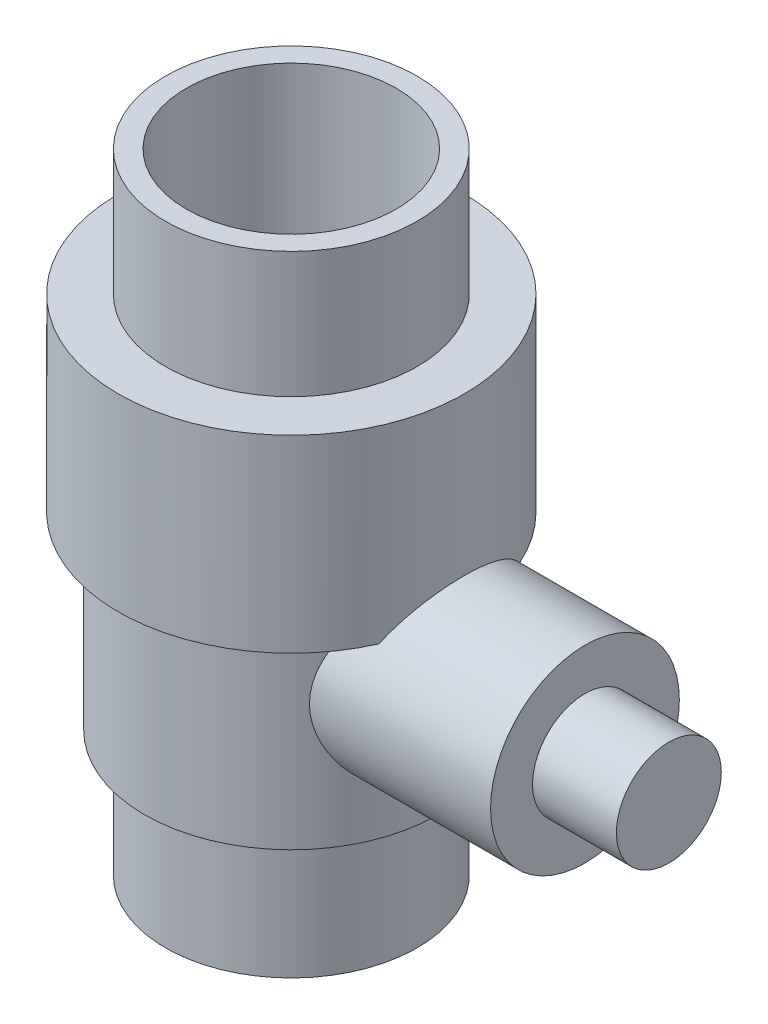
ISO-10303-21;
HEADER;
FILE_DESCRIPTION(('STEP AP214'),'2;1');
FILE_NAME('part.step','',(''),(''),'','','');
FILE_SCHEMA(('AUTOMOTIVE_DESIGN { 1 0 10303 214 1 1 1 1 }'));
ENDSEC;
DATA;
#1=APPLICATION_CONTEXT('core data for automotive mechanical design processes');
#2=APPLICATION_PROTOCOL_DEFINITION('international standard','automotive_design',2000,#1);
#3=PRODUCT_CONTEXT('',#1,'mechanical');
#4=PRODUCT('Part','Part','',(#3));
#5=PRODUCT_RELATED_PRODUCT_CATEGORY('part','',(#4));
#6=PRODUCT_DEFINITION_FORMATION('','',#4);
#7=PRODUCT_DEFINITION_CONTEXT('part definition',#1,'design');
#8=PRODUCT_DEFINITION('design','',#6,#7);
#9=PRODUCT_DEFINITION_SHAPE('','',#8);
#10=(LENGTH_UNIT() NAMED_UNIT(*) SI_UNIT(.MILLI.,.METRE.));
#11=(NAMED_UNIT(*) PLANE_ANGLE_UNIT() SI_UNIT($,.RADIAN.));
#12=(NAMED_UNIT(*) SI_UNIT($,.STERADIAN.) SOLID_ANGLE_UNIT());
#13=UNCERTAINTY_MEASURE_WITH_UNIT(LENGTH_MEASURE(1.E-05),#10,'distance_accuracy_value','');
#14=(GEOMETRIC_REPRESENTATION_CONTEXT(3) GLOBAL_UNCERTAINTY_ASSIGNED_CONTEXT((#13)) GLOBAL_UNIT_ASSIGNED_CONTEXT((#10,
#11,#12)) REPRESENTATION_CONTEXT('',''));
#15=CARTESIAN_POINT('',(0.,0.,0.));
#16=DIRECTION('',(0.,0.,1.));
#17=DIRECTION('',(1.,0.,0.));
#18=AXIS2_PLACEMENT_3D('',#15,#16,#17);
#19=CARTESIAN_POINT('',(0.,11.43,0.));
#20=DIRECTION('',(0.,-1.,0.));
#21=DIRECTION('',(0.,0.,-1.));
#22=AXIS2_PLACEMENT_3D('',#19,#20,#21);
#23=CYLINDRICAL_SURFACE('',#22,10.4775);
#24=CARTESIAN_POINT('',(0.,11.43,0.));
#25=DIRECTION('',(0.,1.,0.));
#26=DIRECTION('',(0.,0.,1.));
#27=AXIS2_PLACEMENT_3D('',#24,#25,#26);
#28=CIRCLE('',#27,10.4775);
#29=CARTESIAN_POINT('',(0.,11.43,10.4775));
#30=VERTEX_POINT('',#29);
#31=EDGE_CURVE('E78',#30,#30,#28,.T.);
#32=ORIENTED_EDGE('',*,*,#31,.F.);
#33=EDGE_LOOP('',(#32));
#34=FACE_BOUND('',#33,.T.);
#35=CARTESIAN_POINT('',(9.57250652911764,0.,-4.2597094971371));
#36=CARTESIAN_POINT('',(9.61951987824772,0.118089284033547,-4.1540834659711));
#37=CARTESIAN_POINT('',(9.66659951996813,0.23178333094485,-4.04355638460404));
#38=CARTESIAN_POINT('',(9.75977150643147,0.449828940803982,-3.81316899584244));
#39=CARTESIAN_POINT('',(9.80586344938626,0.554176754673007,-3.69330497882565));
#40=CARTESIAN_POINT('',(9.8961317564524,0.753392349843491,-3.44416029214909));
#41=CARTESIAN_POINT('',(9.94029707939134,0.848208746919343,-3.31483446520599));
#42=CARTESIAN_POINT('',(10.0253556728197,1.02706190857091,-3.04792713491144));
#43=CARTESIAN_POINT('',(10.0662493188591,1.11109991104951,-2.91034658228731));
#44=CARTESIAN_POINT('',(10.1438507942818,1.2679511254537,-2.62715092456665));
#45=CARTESIAN_POINT('',(10.1805441665103,1.34072585533778,-2.48151048641454));
#46=CARTESIAN_POINT('',(10.2485938872292,1.47395461977562,-2.1835022020408));
#47=CARTESIAN_POINT('',(10.2799507263217,1.53440978700162,-2.03113497585499));
#48=CARTESIAN_POINT('',(10.3363733822117,1.64214960736657,-1.72109175079039));
#49=CARTESIAN_POINT('',(10.3614540336332,1.68946534696871,-1.56342928878107));
#50=CARTESIAN_POINT('',(10.404671739631,1.77046491591027,-1.24371256225527));
#51=CARTESIAN_POINT('',(10.4228095992014,1.80415032566803,-1.08165880922922));
#52=CARTESIAN_POINT('',(10.4503476770598,1.85510381583661,-0.768618673435974));
#53=CARTESIAN_POINT('',(10.460363609863,1.87353167097369,-0.617874351711137));
#54=CARTESIAN_POINT('',(10.4738563320927,1.89832680681131,-0.315110333526037));
#55=CARTESIAN_POINT('',(10.4773336271251,1.90469502003442,-0.16309073659071));
#56=CARTESIAN_POINT('',(10.4776547335944,1.9052836412638,0.141004460245753));
#57=CARTESIAN_POINT('',(10.4744973580537,1.89950187557444,0.293080065300434));
#58=CARTESIAN_POINT('',(10.4616329022995,1.875866713394,0.596006388114685));
#59=CARTESIAN_POINT('',(10.4519260158657,1.85801367405446,0.746857141980171));
#60=CARTESIAN_POINT('',(10.4271099639884,1.81211567708266,1.03583381602913));
#61=CARTESIAN_POINT('',(10.4124181437146,1.7848559067471,1.17412149364444));
#62=CARTESIAN_POINT('',(10.377912400756,1.72037304136471,1.44774441734794));
#63=CARTESIAN_POINT('',(10.358096827001,1.68314673457966,1.58307869646568));
#64=CARTESIAN_POINT('',(10.3137772167424,1.59911227359221,1.84994453682281));
#65=CARTESIAN_POINT('',(10.2892733356578,1.55230443701734,1.98147622395315));
#66=CARTESIAN_POINT('',(10.2360922993972,1.44953671432213,2.24006266267662));
#67=CARTESIAN_POINT('',(10.2074136472761,1.39357354448466,2.36711578801037));
#68=CARTESIAN_POINT('',(10.1126634666585,1.20610504657258,2.75406097295047));
#69=CARTESIAN_POINT('',(10.0403419011773,1.05955391434014,3.00531058898714));
#70=CARTESIAN_POINT('',(9.88569954316698,0.732141082558401,3.48043510480122));
#71=CARTESIAN_POINT('',(9.80338759827642,0.551309663556277,3.70433387931628));
#72=CARTESIAN_POINT('',(9.6950840006323,0.298587251510905,3.97336350784154));
#73=CARTESIAN_POINT('',(9.67061507915596,0.24054640831908,4.03251386447065));
#74=CARTESIAN_POINT('',(9.62159424549838,0.122073188581226,4.14811474323605));
#75=CARTESIAN_POINT('',(9.59704253810471,0.0616449355654946,4.20456957794831));
#76=CARTESIAN_POINT('',(9.57250652911765,0.,4.2597094971371));
#77=B_SPLINE_CURVE_WITH_KNOTS('',3,(#35,#36,#37,#38,#39,#40,#41,#42,#43,#44,#45,#46,#47,#48,#49,
#50,#51,#52,#53,#54,#55,#56,#57,#58,#59,#60,#61,#62,#63,#64,#65,#66,#67,#68,#69,#70,#71,#72,#73,
#74,#75,#76),.UNSPECIFIED.,.F.,.F.,(4,2,2,2,2,2,2,2,2,2,2,2,2,2,2,2,2,2,2,2,4),(0.,
0.495678741250673,0.991555433165369,1.48997623324138,1.98833973813294,2.48837004967115,
2.98835436718655,3.48714549748768,3.98587877704691,4.44186069158156,4.89780734546761,
5.35383557757157,5.8098503178055,6.23451009967212,6.65930689414533,7.08408960889325,
7.5090250146158,8.40435824243394,9.2989042566696,9.55807621222932,9.81681857946104),.UNSPECIFIED.);
#78=CARTESIAN_POINT('',(9.57250652911764,0.,-4.2597094971371));
#79=VERTEX_POINT('',#78);
#80=CARTESIAN_POINT('',(9.57250652911764,0.,4.2597094971371));
#81=VERTEX_POINT('',#80);
#82=EDGE_CURVE('E59',#79,#81,#77,.T.);
#83=ORIENTED_EDGE('',*,*,#82,.F.);
#84=CARTESIAN_POINT('',(0.,0.,0.));
#85=DIRECTION('',(0.,1.,0.));
#86=DIRECTION('',(0.,0.,1.));
#87=AXIS2_PLACEMENT_3D('',#84,#85,#86);
#88=CIRCLE('',#87,10.4775);
#89=EDGE_CURVE('E83',#79,#81,#88,.T.);
#90=ORIENTED_EDGE('',*,*,#89,.T.);
#91=EDGE_LOOP('',(#83,#90));
#92=FACE_BOUND('',#91,.T.);
#93=ADVANCED_FACE('F39',(#34,#92),#23,.T.);
#94=CARTESIAN_POINT('',(0.,0.,0.));
#95=DIRECTION('',(0.,1.,0.));
#96=DIRECTION('',(0.,0.,1.));
#97=AXIS2_PLACEMENT_3D('',#94,#95,#96);
#98=PLANE('',#97);
#99=DIRECTION('',(-1.,0.,0.));
#100=VECTOR('',#99,1.);
#101=CARTESIAN_POINT('',(17.78,0.,-4.2597094971371));
#102=LINE('',#101,#100);
#103=CARTESIAN_POINT('',(7.80301063692726,0.,-4.2597094971371));
#104=VERTEX_POINT('',#103);
#105=EDGE_CURVE('E81',#104,#79,#102,.F.);
#106=ORIENTED_EDGE('',*,*,#105,.F.);
#107=CARTESIAN_POINT('',(0.,0.,0.));
#108=DIRECTION('',(0.,-1.,0.));
#109=DIRECTION('',(0.,0.,-1.));
#110=AXIS2_PLACEMENT_3D('',#107,#108,#109);
#111=CIRCLE('',#110,8.89);
#112=CARTESIAN_POINT('',(7.80301063692726,0.,4.2597094971371));
#113=VERTEX_POINT('',#112);
#114=EDGE_CURVE('E73',#113,#104,#111,.T.);
#115=ORIENTED_EDGE('',*,*,#114,.F.);
#116=DIRECTION('',(-1.,0.,0.));
#117=VECTOR('',#116,1.);
#118=CARTESIAN_POINT('',(17.78,0.,4.2597094971371));
#119=LINE('',#118,#117);
#120=EDGE_CURVE('E66',#81,#113,#119,.T.);
#121=ORIENTED_EDGE('',*,*,#120,.F.);
#122=ORIENTED_EDGE('',*,*,#89,.F.);
#123=EDGE_LOOP('',(#106,#115,#121,#122));
#124=FACE_BOUND('',#123,.T.);
#125=ADVANCED_FACE('F82',(#124),#98,.F.);
#126=CARTESIAN_POINT('',(0.,-11.43,0.));
#127=DIRECTION('',(0.,1.,0.));
#128=DIRECTION('',(0.,0.,1.));
#129=AXIS2_PLACEMENT_3D('',#126,#127,#128);
#130=CYLINDRICAL_SURFACE('',#129,8.89);
#131=CARTESIAN_POINT('',(0.,-11.43,0.));
#132=DIRECTION('',(0.,-1.,0.));
#133=DIRECTION('',(0.,0.,-1.));
#134=AXIS2_PLACEMENT_3D('',#131,#132,#133);
#135=CIRCLE('',#134,8.89);
#136=CARTESIAN_POINT('',(0.,-11.43,-8.89));
#137=VERTEX_POINT('',#136);
#138=EDGE_CURVE('E97',#137,#137,#135,.T.);
#139=ORIENTED_EDGE('',*,*,#138,.F.);
#140=EDGE_LOOP('',(#139));
#141=FACE_BOUND('',#140,.T.);
#142=CARTESIAN_POINT('',(7.80301063692726,0.,4.2597094971371));
#143=CARTESIAN_POINT('',(7.74702109270551,-0.114717258875337,4.36229454189193));
#144=CARTESIAN_POINT('',(7.6909108700755,-0.233532849522619,4.46024561873018));
#145=CARTESIAN_POINT('',(7.57980192052549,-0.47913993161383,4.6465502399896));
#146=CARTESIAN_POINT('',(7.52480424086076,-0.605938514472695,4.73489505552394));
#147=CARTESIAN_POINT('',(7.41692305266653,-0.868191748790887,4.90217848347613));
#148=CARTESIAN_POINT('',(7.3640614653706,-1.00371076700708,4.98103084183833));
#149=CARTESIAN_POINT('',(7.26259162846925,-1.28192135234227,5.12784739877383));
#150=CARTESIAN_POINT('',(7.21398177830432,-1.42461018826834,5.19581570270673));
#151=CARTESIAN_POINT('',(7.09237307937098,-1.81399769241426,5.36161144154597));
#152=CARTESIAN_POINT('',(7.02458865155529,-2.06689725602829,5.44933323619476));
#153=CARTESIAN_POINT('',(6.94162220841268,-2.45671385974612,5.55409259911344));
#154=CARTESIAN_POINT('',(6.91710468353243,-2.5882211931381,5.58451982872599));
#155=CARTESIAN_POINT('',(6.87512774593471,-2.85412515720411,5.63611850504675));
#156=CARTESIAN_POINT('',(6.85766466731854,-2.98852024889001,5.65729475956429));
#157=CARTESIAN_POINT('',(6.83041626880287,-3.2603266362188,5.69016488429684));
#158=CARTESIAN_POINT('',(6.82069257943095,-3.39775335949222,5.70178266232447));
#159=CARTESIAN_POINT('',(6.80959351696969,-3.67343059151896,5.71503392306493));
#160=CARTESIAN_POINT('',(6.80821811633391,-3.81168109755257,5.71666743872236));
#161=CARTESIAN_POINT('',(6.81388318348966,-4.08786109460903,5.70991368494419));
#162=CARTESIAN_POINT('',(6.82092979161644,-4.22579027786452,5.70151910420595));
#163=CARTESIAN_POINT('',(6.84312232890125,-4.5000217944048,5.67486343422911));
#164=CARTESIAN_POINT('',(6.85826807372541,-4.63632416464318,5.65660256954403));
#165=CARTESIAN_POINT('',(6.89411633694343,-4.89279911224195,5.61283988781669));
#166=CARTESIAN_POINT('',(6.91411543476543,-5.01322643840634,5.58824006215865));
#167=CARTESIAN_POINT('',(6.959494603779,-5.25130669783685,5.53162254941875));
#168=CARTESIAN_POINT('',(6.98487643692761,-5.3689587085982,5.49960243309782));
#169=CARTESIAN_POINT('',(7.06799613204953,-5.71692172154828,5.39292790350158));
#170=CARTESIAN_POINT('',(7.13272997046983,-5.94238489597836,5.30763398461354));
#171=CARTESIAN_POINT('',(7.28516429000519,-6.40975647640215,5.09683774372177));
#172=CARTESIAN_POINT('',(7.37484754481953,-6.64913834579353,4.96724637404793));
#173=CARTESIAN_POINT('',(7.5621690848693,-7.10527000587263,4.67712681331657));
#174=CARTESIAN_POINT('',(7.65981538731891,-7.32199647352725,4.51656721577639));
#175=CARTESIAN_POINT('',(7.81724322575241,-7.65061001601749,4.23529710287531));
#176=CARTESIAN_POINT('',(7.87690274969376,-7.7703578295157,4.12354959525506));
#177=CARTESIAN_POINT('',(7.99492610152694,-8.00019129840012,3.88977985700288));
#178=CARTESIAN_POINT('',(8.05328959085829,-8.11027445078161,3.76775498062236));
#179=CARTESIAN_POINT('',(8.1672398063736,-8.32006458358837,3.51392244458413));
#180=CARTESIAN_POINT('',(8.22282703367252,-8.41977344011801,3.38211656115153));
#181=CARTESIAN_POINT('',(8.32982783688115,-8.60803625531386,3.10926362762999));
#182=CARTESIAN_POINT('',(8.3812438179472,-8.69659665870918,2.96822198893136));
#183=CARTESIAN_POINT('',(8.47142309873374,-8.84957985441975,2.69892238676631));
#184=CARTESIAN_POINT('',(8.51093457681721,-8.91563661632032,2.57184131108408));
#185=CARTESIAN_POINT('',(8.58516864374032,-9.03844511972913,2.31197427533585));
#186=CARTESIAN_POINT('',(8.61989351942898,-9.09520130714766,2.17919107956481));
#187=CARTESIAN_POINT('',(8.68382500783757,-9.19884079833252,1.90856198700383));
#188=CARTESIAN_POINT('',(8.71303280086779,-9.24572621407248,1.77071718063594));
#189=CARTESIAN_POINT('',(8.76526197787786,-9.32905759813297,1.49081798462011));
#190=CARTESIAN_POINT('',(8.7882859592371,-9.36550794990688,1.34876539028925));
#191=CARTESIAN_POINT('',(8.82770972403447,-9.42766545507098,1.06061142646593));
#192=CARTESIAN_POINT('',(8.84407365876982,-9.45331449376807,0.914492554053696));
#193=CARTESIAN_POINT('',(8.86957933019421,-9.49320316230882,0.620075067974996));
#194=CARTESIAN_POINT('',(8.87872103866252,-9.50744274757023,0.471776445793503));
#195=CARTESIAN_POINT('',(8.88953768469777,-9.5242844686011,0.174274594601154));
#196=CARTESIAN_POINT('',(8.89121402292642,-9.52688878739349,0.0250715405416735));
#197=CARTESIAN_POINT('',(8.88705772812316,-9.52042263980148,-0.272969798370944));
#198=CARTESIAN_POINT('',(8.88122556333548,-9.51135290143304,-0.421808105390472));
#199=CARTESIAN_POINT('',(8.86302577955869,-9.48295838085502,-0.705180614688105));
#200=CARTESIAN_POINT('',(8.85125966643394,-9.46457684792208,-0.839849639560113));
#201=CARTESIAN_POINT('',(8.82183712226126,-9.41840899519937,-1.10695540991127));
#202=CARTESIAN_POINT('',(8.80417870878486,-9.39061951011567,-1.23939138832053));
#203=CARTESIAN_POINT('',(8.7633476659175,-9.32597829844553,-1.50112262937335));
#204=CARTESIAN_POINT('',(8.74017659610155,-9.28912913481707,-1.63041876892177));
#205=CARTESIAN_POINT('',(8.68878604849334,-9.20677261444848,-1.88521220719106));
#206=CARTESIAN_POINT('',(8.66056462537451,-9.16126192097581,-2.01070802022231));
#207=CARTESIAN_POINT('',(8.56669199001444,-9.00846452429885,-2.39026771405916));
#208=CARTESIAN_POINT('',(8.49348356906455,-8.88746500516018,-2.63711288756438));
#209=CARTESIAN_POINT('',(8.33293659663166,-8.61407918407988,-3.10744841422096));
#210=CARTESIAN_POINT('',(8.24559379558991,-8.46168343896078,-3.3309317101642));
#211=CARTESIAN_POINT('',(8.04940960749165,-8.10505109553274,-3.78260031463149));
#212=CARTESIAN_POINT('',(7.93928357732489,-7.89650946437009,-4.00682835198185));
#213=CARTESIAN_POINT('',(7.71726407205044,-7.44644233885965,-4.4193757634311));
#214=CARTESIAN_POINT('',(7.60536777095097,-7.20485811633337,-4.6076297379617));
#215=CARTESIAN_POINT('',(7.4382022198455,-6.80546174547674,-4.87008568614129));
#216=CARTESIAN_POINT('',(7.37975296123986,-6.65778432548715,-4.95793465879631));
#217=CARTESIAN_POINT('',(7.26777589234353,-6.35356073037061,-5.12067132046023));
#218=CARTESIAN_POINT('',(7.21424905745246,-6.19701280740485,-5.19555644320925));
#219=CARTESIAN_POINT('',(7.11454786259822,-5.87617946028712,-5.33126543298202));
#220=CARTESIAN_POINT('',(7.0683550336594,-5.71191486699438,-5.39212480109359));
#221=CARTESIAN_POINT('',(6.98554474192447,-5.37631219531372,-5.49898630366191));
#222=CARTESIAN_POINT('',(6.9489217225751,-5.20497828882848,-5.54499706338419));
#223=CARTESIAN_POINT('',(6.89678229838562,-4.90955452538164,-5.60960321031258));
#224=CARTESIAN_POINT('',(6.87823286555164,-4.78687728789798,-5.63228127351579));
#225=CARTESIAN_POINT('',(6.8474849960183,-4.53953145904665,-5.66962428235024));
#226=CARTESIAN_POINT('',(6.83528506936089,-4.41486334193687,-5.68429110791699));
#227=CARTESIAN_POINT('',(6.81769357026107,-4.16447275698446,-5.70537852133949));
#228=CARTESIAN_POINT('',(6.81229540802947,-4.03875142862058,-5.71180709081139));
#229=CARTESIAN_POINT('',(6.80849212596161,-3.78704710751032,-5.71634004521282));
#230=CARTESIAN_POINT('',(6.81008728654117,-3.66106410447385,-5.71444409634872));
#231=CARTESIAN_POINT('',(6.82020798783712,-3.40989191408124,-5.70236153086821));
#232=CARTESIAN_POINT('',(6.82872712215918,-3.28470210069054,-5.69218257807589));
#233=CARTESIAN_POINT('',(6.85235603253526,-3.03586098217453,-5.66371297076826));
#234=CARTESIAN_POINT('',(6.86746815862313,-2.91221024182193,-5.64541942381376));
#235=CARTESIAN_POINT('',(6.92197569911223,-2.54451128579985,-5.57868651939002));
#236=CARTESIAN_POINT('',(6.97053524729422,-2.30386619160578,-5.51840252136277));
#237=CARTESIAN_POINT('',(7.10257278424737,-1.77026795533564,-5.34790709871576));
#238=CARTESIAN_POINT('',(7.19204909158072,-1.48184700394954,-5.22838260973566));
#239=CARTESIAN_POINT('',(7.38806712638191,-0.932743411779521,-4.94750118789042));
#240=CARTESIAN_POINT('',(7.49460938990366,-0.672061642731398,-4.78614294089847));
#241=CARTESIAN_POINT('',(7.63668772237406,-0.352763466613332,-4.55161316608438));
#242=CARTESIAN_POINT('',(7.66988214718526,-0.280102623002109,-4.49549490395012));
#243=CARTESIAN_POINT('',(7.73639462358164,-0.137823791896295,-4.38003528801979));
#244=CARTESIAN_POINT('',(7.76971207935263,-0.0681979446306776,-4.32070327749357));
#245=CARTESIAN_POINT('',(7.80301063692726,0.,-4.2597094971371));
#246=B_SPLINE_CURVE_WITH_KNOTS('',3,(#142,#143,#144,#145,#146,#147,#148,#149,#150,#151,#152,
#153,#154,#155,#156,#157,#158,#159,#160,#161,#162,#163,#164,#165,#166,#167,#168,#169,#170,#171,
#172,#173,#174,#175,#176,#177,#178,#179,#180,#181,#182,#183,#184,#185,#186,#187,#188,#189,#190,
#191,#192,#193,#194,#195,#196,#197,#198,#199,#200,#201,#202,#203,#204,#205,#206,#207,#208,#209,
#210,#211,#212,#213,#214,#215,#216,#217,#218,#219,#220,#221,#222,#223,#224,#225,#226,#227,#228,
#229,#230,#231,#232,#233,#234,#235,#236,#237,#238,#239,#240,#241,#242,#243,#244,#245),
.UNSPECIFIED.,.F.,.F.,(4,2,2,2,2,2,2,2,2,2,2,2,2,2,2,2,2,2,2,2,2,2,2,2,2,2,2,2,2,2,2,2,2,2,2,2,
2,2,2,2,2,2,2,2,2,2,2,2,2,2,2,4),(0.,0.491186335819397,0.982815330699825,1.47861949481462,
1.9742362036583,2.79865626927666,3.20980859088358,3.62074697823732,4.0349259074422,
4.4491034699995,4.86358318627087,5.27805346951181,5.65125615953285,6.02458120089542,
6.77078882503172,7.62775927349357,8.48560343372466,9.00805568052673,9.53064283805094,
10.0531353252086,10.5753243677058,11.0206003773542,11.4656629089171,11.910630116852,
12.3554101323871,12.8025535502883,13.2496987153866,13.6967599830381,14.1437933724667,
14.5526000691891,14.9615444453399,15.3703732651098,15.7793599004017,16.6291719314805,
17.4792399383113,18.4517207496072,19.42595301896,19.969836538366,20.5138275994679,
21.0564262407087,21.5987091273344,21.9767035726989,22.3546092788651,22.7321485744321,
23.1097030085763,23.4869085083,23.8642485707374,24.6193737715976,25.5887593412729,
26.5581753660162,26.8509870139295,27.1429888400224),.UNSPECIFIED.);
#247=EDGE_CURVE('E43',#113,#104,#246,.T.);
#248=ORIENTED_EDGE('',*,*,#247,.F.);
#249=ORIENTED_EDGE('',*,*,#114,.T.);
#250=EDGE_LOOP('',(#248,#249));
#251=FACE_BOUND('',#250,.T.);
#252=ADVANCED_FACE('F75',(#141,#251),#130,.T.);
#253=CARTESIAN_POINT('',(0.,11.43,0.));
#254=DIRECTION('',(0.,1.,0.));
#255=DIRECTION('',(0.,0.,1.));
#256=AXIS2_PLACEMENT_3D('',#253,#254,#255);
#257=PLANE('',#256);
#258=CARTESIAN_POINT('',(0.,11.43,0.));
#259=DIRECTION('',(0.,1.,0.));
#260=DIRECTION('',(0.,0.,1.));
#261=AXIS2_PLACEMENT_3D('',#258,#259,#260);
#262=CIRCLE('',#261,7.62);
#263=CARTESIAN_POINT('',(0.,11.43,-7.62));
#264=VERTEX_POINT('',#263);
#265=EDGE_CURVE('E87',#264,#264,#262,.T.);
#266=ORIENTED_EDGE('',*,*,#265,.F.);
#267=EDGE_LOOP('',(#266));
#268=FACE_BOUND('',#267,.T.);
#269=ORIENTED_EDGE('',*,*,#31,.T.);
#270=EDGE_LOOP('',(#269));
#271=FACE_BOUND('',#270,.T.);
#272=ADVANCED_FACE('F132',(#268,#271),#257,.T.);
#273=CARTESIAN_POINT('',(0.,-11.43,0.));
#274=DIRECTION('',(0.,-1.,0.));
#275=DIRECTION('',(0.,0.,-1.));
#276=AXIS2_PLACEMENT_3D('',#273,#274,#275);
#277=PLANE('',#276);
#278=CARTESIAN_POINT('',(0.,-11.43,0.));
#279=DIRECTION('',(0.,-1.,0.));
#280=DIRECTION('',(0.,0.,-1.));
#281=AXIS2_PLACEMENT_3D('',#278,#279,#280);
#282=CIRCLE('',#281,7.62);
#283=CARTESIAN_POINT('',(0.,-11.43,-7.62));
#284=VERTEX_POINT('',#283);
#285=EDGE_CURVE('E77',#284,#284,#282,.T.);
#286=ORIENTED_EDGE('',*,*,#285,.F.);
#287=EDGE_LOOP('',(#286));
#288=FACE_BOUND('',#287,.T.);
#289=ORIENTED_EDGE('',*,*,#138,.T.);
#290=EDGE_LOOP('',(#289));
#291=FACE_BOUND('',#290,.T.);
#292=ADVANCED_FACE('F122',(#288,#291),#277,.T.);
#293=CARTESIAN_POINT('',(0.,-19.05,0.));
#294=DIRECTION('',(0.,-1.,0.));
#295=DIRECTION('',(0.,0.,-1.));
#296=AXIS2_PLACEMENT_3D('',#293,#294,#295);
#297=PLANE('',#296);
#298=CARTESIAN_POINT('',(0.,-19.05,0.));
#299=DIRECTION('',(0.,1.,0.));
#300=DIRECTION('',(0.,0.,1.));
#301=AXIS2_PLACEMENT_3D('',#298,#299,#300);
#302=CIRCLE('',#301,6.35);
#303=CARTESIAN_POINT('',(0.,-19.05,6.35));
#304=VERTEX_POINT('',#303);
#305=EDGE_CURVE('E228',#304,#304,#302,.T.);
#306=ORIENTED_EDGE('',*,*,#305,.T.);
#307=EDGE_LOOP('',(#306));
#308=FACE_BOUND('',#307,.T.);
#309=CARTESIAN_POINT('',(0.,-19.05,0.));
#310=DIRECTION('',(0.,-1.,0.));
#311=DIRECTION('',(0.,0.,-1.));
#312=AXIS2_PLACEMENT_3D('',#309,#310,#311);
#313=CIRCLE('',#312,7.62);
#314=CARTESIAN_POINT('',(0.,-19.05,-7.62));
#315=VERTEX_POINT('',#314);
#316=EDGE_CURVE('E102',#315,#315,#313,.T.);
#317=ORIENTED_EDGE('',*,*,#316,.T.);
#318=EDGE_LOOP('',(#317));
#319=FACE_BOUND('',#318,.T.);
#320=ADVANCED_FACE('F117',(#308,#319),#297,.T.);
#321=CARTESIAN_POINT('',(0.,19.05,0.));
#322=DIRECTION('',(0.,-1.,0.));
#323=DIRECTION('',(0.,0.,-1.));
#324=AXIS2_PLACEMENT_3D('',#321,#322,#323);
#325=CYLINDRICAL_SURFACE('',#324,7.62);
#326=CARTESIAN_POINT('',(0.,-11.43,-7.62));
#327=CARTESIAN_POINT('',(0.,-11.509375,-7.62));
#328=CARTESIAN_POINT('',(0.,-11.58875,-7.62));
#329=CARTESIAN_POINT('',(0.,-11.7475,-7.62));
#330=CARTESIAN_POINT('',(0.,-11.826875,-7.62));
#331=CARTESIAN_POINT('',(0.,-11.985625,-7.62));
#332=CARTESIAN_POINT('',(0.,-12.065,-7.62));
#333=CARTESIAN_POINT('',(0.,-12.22375,-7.62));
#334=CARTESIAN_POINT('',(0.,-12.303125,-7.62));
#335=CARTESIAN_POINT('',(0.,-12.461875,-7.62));
#336=CARTESIAN_POINT('',(0.,-12.54125,-7.62));
#337=CARTESIAN_POINT('',(0.,-12.7,-7.62));
#338=CARTESIAN_POINT('',(0.,-12.779375,-7.62));
#339=CARTESIAN_POINT('',(0.,-12.938125,-7.62));
#340=CARTESIAN_POINT('',(0.,-13.0175,-7.62));
#341=CARTESIAN_POINT('',(0.,-13.17625,-7.62));
#342=CARTESIAN_POINT('',(0.,-13.255625,-7.62));
#343=CARTESIAN_POINT('',(0.,-13.414375,-7.62));
#344=CARTESIAN_POINT('',(0.,-13.49375,-7.62));
#345=CARTESIAN_POINT('',(0.,-13.6525,-7.62));
#346=CARTESIAN_POINT('',(0.,-13.731875,-7.62));
#347=CARTESIAN_POINT('',(0.,-13.890625,-7.62));
#348=CARTESIAN_POINT('',(0.,-13.97,-7.62));
#349=CARTESIAN_POINT('',(0.,-14.12875,-7.62));
#350=CARTESIAN_POINT('',(0.,-14.208125,-7.62));
#351=CARTESIAN_POINT('',(0.,-14.366875,-7.62));
#352=CARTESIAN_POINT('',(0.,-14.44625,-7.62));
#353=CARTESIAN_POINT('',(0.,-14.605,-7.62));
#354=CARTESIAN_POINT('',(0.,-14.684375,-7.62));
#355=CARTESIAN_POINT('',(0.,-14.843125,-7.62));
#356=CARTESIAN_POINT('',(0.,-14.9225,-7.62));
#357=CARTESIAN_POINT('',(0.,-15.08125,-7.62));
#358=CARTESIAN_POINT('',(0.,-15.160625,-7.62));
#359=CARTESIAN_POINT('',(0.,-15.319375,-7.62));
#360=CARTESIAN_POINT('',(0.,-15.39875,-7.62));
#361=CARTESIAN_POINT('',(0.,-15.5575,-7.62));
#362=CARTESIAN_POINT('',(0.,-15.636875,-7.62));
#363=CARTESIAN_POINT('',(0.,-15.795625,-7.62));
#364=CARTESIAN_POINT('',(0.,-15.875,-7.62));
#365=CARTESIAN_POINT('',(0.,-16.03375,-7.62));
#366=CARTESIAN_POINT('',(0.,-16.113125,-7.62));
#367=CARTESIAN_POINT('',(0.,-16.271875,-7.62));
#368=CARTESIAN_POINT('',(0.,-16.35125,-7.62));
#369=CARTESIAN_POINT('',(0.,-16.51,-7.62));
#370=CARTESIAN_POINT('',(0.,-16.589375,-7.62));
#371=CARTESIAN_POINT('',(0.,-16.748125,-7.62));
#372=CARTESIAN_POINT('',(0.,-16.8275,-7.62));
#373=CARTESIAN_POINT('',(0.,-16.98625,-7.62));
#374=CARTESIAN_POINT('',(0.,-17.065625,-7.62));
#375=CARTESIAN_POINT('',(0.,-17.224375,-7.62));
#376=CARTESIAN_POINT('',(0.,-17.30375,-7.62));
#377=CARTESIAN_POINT('',(0.,-17.4625,-7.62));
#378=CARTESIAN_POINT('',(0.,-17.541875,-7.62));
#379=CARTESIAN_POINT('',(0.,-17.700625,-7.62));
#380=CARTESIAN_POINT('',(0.,-17.78,-7.62));
#381=CARTESIAN_POINT('',(0.,-17.93875,-7.62));
#382=CARTESIAN_POINT('',(0.,-18.018125,-7.62));
#383=CARTESIAN_POINT('',(0.,-18.176875,-7.62));
#384=CARTESIAN_POINT('',(0.,-18.25625,-7.62));
#385=CARTESIAN_POINT('',(0.,-18.415,-7.62));
#386=CARTESIAN_POINT('',(0.,-18.494375,-7.62));
#387=CARTESIAN_POINT('',(0.,-18.653125,-7.62));
#388=CARTESIAN_POINT('',(0.,-18.7325,-7.62));
#389=CARTESIAN_POINT('',(0.,-18.89125,-7.62));
#390=CARTESIAN_POINT('',(0.,-18.970625,-7.62));
#391=CARTESIAN_POINT('',(0.,-19.05,-7.62));
#392=B_SPLINE_CURVE_WITH_KNOTS('',3,(#326,#327,#328,#329,#330,#331,#332,#333,#334,#335,#336,
#337,#338,#339,#340,#341,#342,#343,#344,#345,#346,#347,#348,#349,#350,#351,#352,#353,#354,#355,
#356,#357,#358,#359,#360,#361,#362,#363,#364,#365,#366,#367,#368,#369,#370,#371,#372,#373,#374,
#375,#376,#377,#378,#379,#380,#381,#382,#383,#384,#385,#386,#387,#388,#389,#390,#391),
.UNSPECIFIED.,.F.,.F.,(4,2,2,2,2,2,2,2,2,2,2,2,2,2,2,2,2,2,2,2,2,2,2,2,2,2,2,2,2,2,2,2,4),(0.,
0.238124999999999,0.476250000000001,0.714375,0.952499999999998,1.190625,1.42875,
1.66687499999999,1.90499999999999,2.14312499999999,2.38125,2.619375,2.8575,3.09562499999999,
3.33374999999999,3.57187499999999,3.81,4.048125,4.28624999999999,4.52437499999999,
4.76249999999999,5.00062499999999,5.23874999999999,5.476875,5.71499999999999,5.95312499999999,
6.19124999999999,6.42937499999999,6.66749999999999,6.90562499999999,7.14374999999999,
7.38187499999999,7.61999999999999),.UNSPECIFIED.);
#393=EDGE_CURVE('BSEAM121',#284,#315,#392,.T.);
#394=ORIENTED_EDGE('',*,*,#285,.T.);
#395=ORIENTED_EDGE('',*,*,#316,.F.);
#396=ORIENTED_EDGE('',*,*,#393,.T.);
#397=ORIENTED_EDGE('',*,*,#393,.F.);
#398=EDGE_LOOP('',(#394,#396,#395,#397));
#399=FACE_BOUND('',#398,.T.);
#400=ADVANCED_FACE('F121',(#399),#325,.T.);
#401=CARTESIAN_POINT('',(0.,19.05,0.));
#402=DIRECTION('',(0.,-1.,0.));
#403=DIRECTION('',(0.,0.,-1.));
#404=AXIS2_PLACEMENT_3D('',#401,#402,#403);
#405=CIRCLE('',#404,7.62);
#406=CARTESIAN_POINT('',(0.,19.05,-7.62));
#407=VERTEX_POINT('',#406);
#408=EDGE_CURVE('E95',#407,#407,#405,.T.);
#409=CARTESIAN_POINT('',(0.,11.43,-7.62));
#410=CARTESIAN_POINT('',(0.,11.509375,-7.62));
#411=CARTESIAN_POINT('',(0.,11.58875,-7.62));
#412=CARTESIAN_POINT('',(0.,11.7475,-7.62));
#413=CARTESIAN_POINT('',(0.,11.826875,-7.62));
#414=CARTESIAN_POINT('',(0.,11.985625,-7.62));
#415=CARTESIAN_POINT('',(0.,12.065,-7.62));
#416=CARTESIAN_POINT('',(0.,12.22375,-7.62));
#417=CARTESIAN_POINT('',(0.,12.303125,-7.62));
#418=CARTESIAN_POINT('',(0.,12.461875,-7.62));
#419=CARTESIAN_POINT('',(0.,12.54125,-7.62));
#420=CARTESIAN_POINT('',(0.,12.7,-7.62));
#421=CARTESIAN_POINT('',(0.,12.779375,-7.62));
#422=CARTESIAN_POINT('',(0.,12.938125,-7.62));
#423=CARTESIAN_POINT('',(0.,13.0175,-7.62));
#424=CARTESIAN_POINT('',(0.,13.17625,-7.62));
#425=CARTESIAN_POINT('',(0.,13.255625,-7.62));
#426=CARTESIAN_POINT('',(0.,13.414375,-7.62));
#427=CARTESIAN_POINT('',(0.,13.49375,-7.62));
#428=CARTESIAN_POINT('',(0.,13.6525,-7.62));
#429=CARTESIAN_POINT('',(0.,13.731875,-7.62));
#430=CARTESIAN_POINT('',(0.,13.890625,-7.62));
#431=CARTESIAN_POINT('',(0.,13.97,-7.62));
#432=CARTESIAN_POINT('',(0.,14.12875,-7.62));
#433=CARTESIAN_POINT('',(0.,14.208125,-7.62));
#434=CARTESIAN_POINT('',(0.,14.366875,-7.62));
#435=CARTESIAN_POINT('',(0.,14.44625,-7.62));
#436=CARTESIAN_POINT('',(0.,14.605,-7.62));
#437=CARTESIAN_POINT('',(0.,14.684375,-7.62));
#438=CARTESIAN_POINT('',(0.,14.843125,-7.62));
#439=CARTESIAN_POINT('',(0.,14.9225,-7.62));
#440=CARTESIAN_POINT('',(0.,15.08125,-7.62));
#441=CARTESIAN_POINT('',(0.,15.160625,-7.62));
#442=CARTESIAN_POINT('',(0.,15.319375,-7.62));
#443=CARTESIAN_POINT('',(0.,15.39875,-7.62));
#444=CARTESIAN_POINT('',(0.,15.5575,-7.62));
#445=CARTESIAN_POINT('',(0.,15.636875,-7.62));
#446=CARTESIAN_POINT('',(0.,15.795625,-7.62));
#447=CARTESIAN_POINT('',(0.,15.875,-7.62));
#448=CARTESIAN_POINT('',(0.,16.03375,-7.62));
#449=CARTESIAN_POINT('',(0.,16.113125,-7.62));
#450=CARTESIAN_POINT('',(0.,16.271875,-7.62));
#451=CARTESIAN_POINT('',(0.,16.35125,-7.62));
#452=CARTESIAN_POINT('',(0.,16.51,-7.62));
#453=CARTESIAN_POINT('',(0.,16.589375,-7.62));
#454=CARTESIAN_POINT('',(0.,16.748125,-7.62));
#455=CARTESIAN_POINT('',(0.,16.8275,-7.62));
#456=CARTESIAN_POINT('',(0.,16.98625,-7.62));
#457=CARTESIAN_POINT('',(0.,17.065625,-7.62));
#458=CARTESIAN_POINT('',(0.,17.224375,-7.62));
#459=CARTESIAN_POINT('',(0.,17.30375,-7.62));
#460=CARTESIAN_POINT('',(0.,17.4625,-7.62));
#461=CARTESIAN_POINT('',(0.,17.541875,-7.62));
#462=CARTESIAN_POINT('',(0.,17.700625,-7.62));
#463=CARTESIAN_POINT('',(0.,17.78,-7.62));
#464=CARTESIAN_POINT('',(0.,17.93875,-7.62));
#465=CARTESIAN_POINT('',(0.,18.018125,-7.62));
#466=CARTESIAN_POINT('',(0.,18.176875,-7.62));
#467=CARTESIAN_POINT('',(0.,18.25625,-7.62));
#468=CARTESIAN_POINT('',(0.,18.415,-7.62));
#469=CARTESIAN_POINT('',(0.,18.494375,-7.62));
#470=CARTESIAN_POINT('',(0.,18.653125,-7.62));
#471=CARTESIAN_POINT('',(0.,18.7325,-7.62));
#472=CARTESIAN_POINT('',(0.,18.89125,-7.62));
#473=CARTESIAN_POINT('',(0.,18.970625,-7.62));
#474=CARTESIAN_POINT('',(0.,19.05,-7.62));
#475=B_SPLINE_CURVE_WITH_KNOTS('',3,(#409,#410,#411,#412,#413,#414,#415,#416,#417,#418,#419,
#420,#421,#422,#423,#424,#425,#426,#427,#428,#429,#430,#431,#432,#433,#434,#435,#436,#437,#438,
#439,#440,#441,#442,#443,#444,#445,#446,#447,#448,#449,#450,#451,#452,#453,#454,#455,#456,#457,
#458,#459,#460,#461,#462,#463,#464,#465,#466,#467,#468,#469,#470,#471,#472,#473,#474),
.UNSPECIFIED.,.F.,.F.,(4,2,2,2,2,2,2,2,2,2,2,2,2,2,2,2,2,2,2,2,2,2,2,2,2,2,2,2,2,2,2,2,4),(0.,
0.238124999999999,0.476249999999999,0.714375,0.952499999999998,1.190625,1.42875,1.666875,1.905,
2.143125,2.38125,2.619375,2.8575,3.095625,3.33375,3.571875,3.81,4.048125,4.28625,4.524375,
4.7625,5.000625,5.23875,5.476875,5.715,5.953125,6.19125,6.429375,6.6675,6.905625,7.14375,
7.381875,7.62),.UNSPECIFIED.);
#476=EDGE_CURVE('BSEAM126',#264,#407,#475,.T.);
#477=ORIENTED_EDGE('',*,*,#265,.T.);
#478=ORIENTED_EDGE('',*,*,#408,.T.);
#479=ORIENTED_EDGE('',*,*,#476,.T.);
#480=ORIENTED_EDGE('',*,*,#476,.F.);
#481=EDGE_LOOP('',(#477,#479,#478,#480));
#482=FACE_BOUND('',#481,.T.);
#483=ADVANCED_FACE('F126',(#482),#325,.T.);
#484=CARTESIAN_POINT('',(0.,19.05,0.));
#485=DIRECTION('',(0.,-1.,0.));
#486=DIRECTION('',(0.,0.,-1.));
#487=AXIS2_PLACEMENT_3D('',#484,#485,#486);
#488=PLANE('',#487);
#489=CARTESIAN_POINT('',(0.,19.05,0.));
#490=DIRECTION('',(0.,1.,0.));
#491=DIRECTION('',(0.,0.,1.));
#492=AXIS2_PLACEMENT_3D('',#489,#490,#491);
#493=CIRCLE('',#492,6.35);
#494=CARTESIAN_POINT('',(0.,19.05,6.35));
#495=VERTEX_POINT('',#494);
#496=EDGE_CURVE('E231',#495,#495,#493,.T.);
#497=ORIENTED_EDGE('',*,*,#496,.F.);
#498=EDGE_LOOP('',(#497));
#499=FACE_BOUND('',#498,.T.);
#500=ORIENTED_EDGE('',*,*,#408,.F.);
#501=EDGE_LOOP('',(#500));
#502=FACE_BOUND('',#501,.T.);
#503=ADVANCED_FACE('F114',(#499,#502),#488,.F.);
#504=CARTESIAN_POINT('',(17.78,-3.81,0.));
#505=DIRECTION('',(-1.,0.,0.));
#506=DIRECTION('',(0.,0.,1.));
#507=AXIS2_PLACEMENT_3D('',#504,#505,#506);
#508=CYLINDRICAL_SURFACE('',#507,5.715);
#509=CARTESIAN_POINT('',(17.78,-3.81,0.));
#510=DIRECTION('',(1.,0.,0.));
#511=DIRECTION('',(0.,0.,-1.));
#512=AXIS2_PLACEMENT_3D('',#509,#510,#511);
#513=CIRCLE('',#512,5.715);
#514=CARTESIAN_POINT('',(17.78,-3.81,-5.715));
#515=VERTEX_POINT('',#514);
#516=EDGE_CURVE('E237',#515,#515,#513,.T.);
#517=ORIENTED_EDGE('',*,*,#516,.F.);
#518=EDGE_LOOP('',(#517));
#519=FACE_BOUND('',#518,.T.);
#520=ORIENTED_EDGE('',*,*,#105,.T.);
#521=ORIENTED_EDGE('',*,*,#82,.T.);
#522=ORIENTED_EDGE('',*,*,#120,.T.);
#523=ORIENTED_EDGE('',*,*,#247,.T.);
#524=EDGE_LOOP('',(#520,#521,#522,#523));
#525=FACE_BOUND('',#524,.T.);
#526=ADVANCED_FACE('F86',(#519,#525),#508,.T.);
#527=CARTESIAN_POINT('',(17.78,0.,0.));
#528=DIRECTION('',(1.,0.,0.));
#529=DIRECTION('',(0.,0.,-1.));
#530=AXIS2_PLACEMENT_3D('',#527,#528,#529);
#531=PLANE('',#530);
#532=CARTESIAN_POINT('',(17.78,-3.81,0.));
#533=DIRECTION('',(1.,0.,0.));
#534=DIRECTION('',(0.,0.,-1.));
#535=AXIS2_PLACEMENT_3D('',#532,#533,#534);
#536=CIRCLE('',#535,3.175);
#537=CARTESIAN_POINT('',(17.78,-3.81,-3.175));
#538=VERTEX_POINT('',#537);
#539=EDGE_CURVE('E11',#538,#538,#536,.T.);
#540=ORIENTED_EDGE('',*,*,#539,.F.);
#541=EDGE_LOOP('',(#540));
#542=FACE_BOUND('',#541,.T.);
#543=ORIENTED_EDGE('',*,*,#516,.T.);
#544=EDGE_LOOP('',(#543));
#545=FACE_BOUND('',#544,.T.);
#546=ADVANCED_FACE('F113',(#542,#545),#531,.T.);
#547=CARTESIAN_POINT('',(22.86,-3.81,0.));
#548=DIRECTION('',(-1.,0.,0.));
#549=DIRECTION('',(0.,0.,1.));
#550=AXIS2_PLACEMENT_3D('',#547,#548,#549);
#551=CYLINDRICAL_SURFACE('',#550,3.175);
#552=CARTESIAN_POINT('',(22.86,-3.81,0.));
#553=DIRECTION('',(1.,0.,0.));
#554=DIRECTION('',(0.,0.,-1.));
#555=AXIS2_PLACEMENT_3D('',#552,#553,#554);
#556=CIRCLE('',#555,3.175);
#557=CARTESIAN_POINT('',(22.86,-3.81,-3.175));
#558=VERTEX_POINT('',#557);
#559=EDGE_CURVE('E233',#558,#558,#556,.T.);
#560=ORIENTED_EDGE('',*,*,#559,.F.);
#561=EDGE_LOOP('',(#560));
#562=FACE_BOUND('',#561,.T.);
#563=ORIENTED_EDGE('',*,*,#539,.T.);
#564=EDGE_LOOP('',(#563));
#565=FACE_BOUND('',#564,.T.);
#566=ADVANCED_FACE('F180',(#562,#565),#551,.T.);
#567=CARTESIAN_POINT('',(22.86,-3.81,0.));
#568=DIRECTION('',(1.,0.,0.));
#569=DIRECTION('',(0.,0.,-1.));
#570=AXIS2_PLACEMENT_3D('',#567,#568,#569);
#571=PLANE('',#570);
#572=ORIENTED_EDGE('',*,*,#559,.T.);
#573=EDGE_LOOP('',(#572));
#574=FACE_BOUND('',#573,.T.);
#575=ADVANCED_FACE('F189',(#574),#571,.T.);
#576=CARTESIAN_POINT('',(0.,-19.05,0.));
#577=DIRECTION('',(0.,1.,0.));
#578=DIRECTION('',(0.,0.,1.));
#579=AXIS2_PLACEMENT_3D('',#576,#577,#578);
#580=CYLINDRICAL_SURFACE('',#579,6.35);
#581=ORIENTED_EDGE('',*,*,#305,.F.);
#582=EDGE_LOOP('',(#581));
#583=FACE_BOUND('',#582,.T.);
#584=ORIENTED_EDGE('',*,*,#496,.T.);
#585=EDGE_LOOP('',(#584));
#586=FACE_BOUND('',#585,.T.);
#587=ADVANCED_FACE('F198',(#583,#586),#580,.F.);
#588=CLOSED_SHELL('',(#93,#125,#252,#272,#292,#320,#400,#483,#503,#526,#546,#566,#575,#587));
#589=MANIFOLD_SOLID_BREP('B2',#588);
#590=ADVANCED_BREP_SHAPE_REPRESENTATION('',(#18,#589),#14);
#591=SHAPE_DEFINITION_REPRESENTATION(#9,#590);
ENDSEC;
END-ISO-10303-21;
